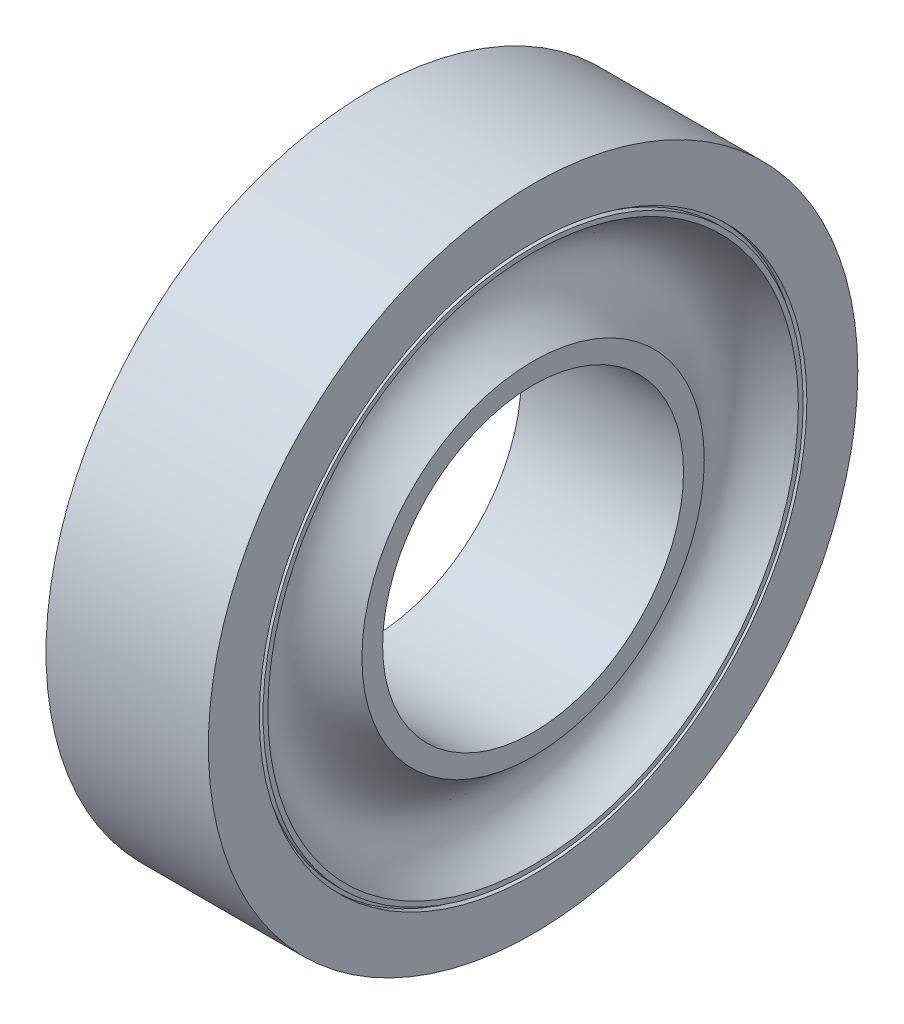
ISO-10303-21;
HEADER;
FILE_DESCRIPTION(('STEP AP214'),'2;1');
FILE_NAME('part.step','',(''),(''),'','','');
FILE_SCHEMA(('AUTOMOTIVE_DESIGN { 1 0 10303 214 1 1 1 1 }'));
ENDSEC;
DATA;
#1=APPLICATION_CONTEXT('core data for automotive mechanical design processes');
#2=APPLICATION_PROTOCOL_DEFINITION('international standard','automotive_design',2000,#1);
#3=PRODUCT_CONTEXT('',#1,'mechanical');
#4=PRODUCT('Part','Part','',(#3));
#5=PRODUCT_RELATED_PRODUCT_CATEGORY('part','',(#4));
#6=PRODUCT_DEFINITION_FORMATION('','',#4);
#7=PRODUCT_DEFINITION_CONTEXT('part definition',#1,'design');
#8=PRODUCT_DEFINITION('design','',#6,#7);
#9=PRODUCT_DEFINITION_SHAPE('','',#8);
#10=(LENGTH_UNIT() NAMED_UNIT(*) SI_UNIT(.MILLI.,.METRE.));
#11=(NAMED_UNIT(*) PLANE_ANGLE_UNIT() SI_UNIT($,.RADIAN.));
#12=(NAMED_UNIT(*) SI_UNIT($,.STERADIAN.) SOLID_ANGLE_UNIT());
#13=UNCERTAINTY_MEASURE_WITH_UNIT(LENGTH_MEASURE(1.E-05),#10,'distance_accuracy_value','');
#14=(GEOMETRIC_REPRESENTATION_CONTEXT(3) GLOBAL_UNCERTAINTY_ASSIGNED_CONTEXT((#13)) GLOBAL_UNIT_ASSIGNED_CONTEXT((#10,
#11,#12)) REPRESENTATION_CONTEXT('',''));
#15=CARTESIAN_POINT('',(0.,0.,0.));
#16=DIRECTION('',(0.,0.,1.));
#17=DIRECTION('',(1.,0.,0.));
#18=AXIS2_PLACEMENT_3D('',#15,#16,#17);
#19=CARTESIAN_POINT('',(-7.5,13.9,0.));
#20=DIRECTION('',(-1.,0.,0.));
#21=DIRECTION('',(0.,0.,1.));
#22=AXIS2_PLACEMENT_3D('',#19,#20,#21);
#23=PLANE('',#22);
#24=CARTESIAN_POINT('',(-7.49999999999999,0.,0.));
#25=DIRECTION('',(1.,0.,0.));
#26=DIRECTION('',(0.,0.,-1.));
#27=AXIS2_PLACEMENT_3D('',#24,#25,#26);
#28=CIRCLE('',#27,13.9);
#29=CARTESIAN_POINT('',(-7.49999999999999,0.,-13.9));
#30=VERTEX_POINT('',#29);
#31=EDGE_CURVE('E82',#30,#30,#28,.T.);
#32=ORIENTED_EDGE('',*,*,#31,.T.);
#33=EDGE_LOOP('',(#32));
#34=FACE_BOUND('',#33,.T.);
#35=CARTESIAN_POINT('',(-7.49999999999999,0.,0.));
#36=DIRECTION('',(1.,0.,0.));
#37=DIRECTION('',(0.,0.,-1.));
#38=AXIS2_PLACEMENT_3D('',#35,#36,#37);
#39=CIRCLE('',#38,15.8150324311788);
#40=CARTESIAN_POINT('',(-7.49999999999999,0.,-15.8150324311788));
#41=VERTEX_POINT('',#40);
#42=EDGE_CURVE('E10',#41,#41,#39,.T.);
#43=ORIENTED_EDGE('',*,*,#42,.F.);
#44=EDGE_LOOP('',(#43));
#45=FACE_BOUND('',#44,.T.);
#46=ADVANCED_FACE('F30',(#34,#45),#23,.T.);
#47=CARTESIAN_POINT('',(-7.5,24.5077089180318,0.));
#48=CARTESIAN_POINT('',(-0.221533758612963,20.8547837469212,0.));
#49=CARTESIAN_POINT('',(-7.5,15.8150324311788,0.));
#50=B_SPLINE_CURVE_WITH_KNOTS('',2,(#47,#48,#49),.UNSPECIFIED.,.F.,.F.,(3,3),(0.,1.),.UNSPECIFIED.);
#51=CARTESIAN_POINT('',(37.4227840582204,0.,0.));
#52=DIRECTION('',(1.,0.,0.));
#53=AXIS1_PLACEMENT('',#51,#52);
#54=SURFACE_OF_REVOLUTION('',#50,#53);
#55=ORIENTED_EDGE('',*,*,#42,.T.);
#56=EDGE_LOOP('',(#55));
#57=FACE_BOUND('',#56,.T.);
#58=CARTESIAN_POINT('',(-7.49999999999999,0.,0.));
#59=DIRECTION('',(1.,0.,0.));
#60=DIRECTION('',(0.,0.,-1.));
#61=AXIS2_PLACEMENT_3D('',#58,#59,#60);
#62=CIRCLE('',#61,24.5077089180318);
#63=CARTESIAN_POINT('',(-7.49999999999999,0.,-24.5077089180318));
#64=VERTEX_POINT('',#63);
#65=EDGE_CURVE('E36',#64,#64,#62,.T.);
#66=ORIENTED_EDGE('',*,*,#65,.F.);
#67=EDGE_LOOP('',(#66));
#68=FACE_BOUND('',#67,.T.);
#69=ADVANCED_FACE('F95',(#57,#68),#54,.F.);
#70=CARTESIAN_POINT('',(-7.5,24.5077089180318,0.));
#71=DIRECTION('',(-1.,0.,0.));
#72=DIRECTION('',(0.,0.,1.));
#73=AXIS2_PLACEMENT_3D('',#70,#71,#72);
#74=PLANE('',#73);
#75=ORIENTED_EDGE('',*,*,#65,.T.);
#76=EDGE_LOOP('',(#75));
#77=FACE_BOUND('',#76,.T.);
#78=CARTESIAN_POINT('',(-7.49999999999999,0.,0.));
#79=DIRECTION('',(1.,0.,0.));
#80=DIRECTION('',(0.,0.,-1.));
#81=AXIS2_PLACEMENT_3D('',#78,#79,#80);
#82=CIRCLE('',#81,24.9502716062252);
#83=CARTESIAN_POINT('',(-7.49999999999999,0.,-24.9502716062252));
#84=VERTEX_POINT('',#83);
#85=EDGE_CURVE('E40',#84,#84,#82,.T.);
#86=ORIENTED_EDGE('',*,*,#85,.F.);
#87=EDGE_LOOP('',(#86));
#88=FACE_BOUND('',#87,.T.);
#89=ADVANCED_FACE('F98',(#77,#88),#74,.T.);
#90=CARTESIAN_POINT('',(37.4227840582204,0.,0.));
#91=DIRECTION('',(1.,0.,0.));
#92=DIRECTION('',(0.,0.,-1.));
#93=AXIS2_PLACEMENT_3D('',#90,#91,#92);
#94=CYLINDRICAL_SURFACE('',#93,24.9502716062252);
#95=ORIENTED_EDGE('',*,*,#85,.T.);
#96=EDGE_LOOP('',(#95));
#97=FACE_BOUND('',#96,.T.);
#98=CARTESIAN_POINT('',(-6.95807618193402,0.,0.));
#99=DIRECTION('',(1.,0.,0.));
#100=DIRECTION('',(0.,0.,-1.));
#101=AXIS2_PLACEMENT_3D('',#98,#99,#100);
#102=CIRCLE('',#101,24.9502716062252);
#103=CARTESIAN_POINT('',(-6.95807618193402,0.,-24.9502716062252));
#104=VERTEX_POINT('',#103);
#105=EDGE_CURVE('E44',#104,#104,#102,.T.);
#106=ORIENTED_EDGE('',*,*,#105,.F.);
#107=EDGE_LOOP('',(#106));
#108=FACE_BOUND('',#107,.T.);
#109=ADVANCED_FACE('F101',(#97,#108),#94,.T.);
#110=CARTESIAN_POINT('',(-6.95807618193403,24.9502716062252,0.));
#111=DIRECTION('',(-1.,0.,0.));
#112=DIRECTION('',(0.,0.,1.));
#113=AXIS2_PLACEMENT_3D('',#110,#111,#112);
#114=PLANE('',#113);
#115=ORIENTED_EDGE('',*,*,#105,.T.);
#116=EDGE_LOOP('',(#115));
#117=FACE_BOUND('',#116,.T.);
#118=CARTESIAN_POINT('',(-6.95807618193402,0.,0.));
#119=DIRECTION('',(1.,0.,0.));
#120=DIRECTION('',(0.,0.,-1.));
#121=AXIS2_PLACEMENT_3D('',#118,#119,#120);
#122=CIRCLE('',#121,25.2929007841813);
#123=CARTESIAN_POINT('',(-6.95807618193402,0.,-25.2929007841813));
#124=VERTEX_POINT('',#123);
#125=EDGE_CURVE('E49',#124,#124,#122,.T.);
#126=ORIENTED_EDGE('',*,*,#125,.F.);
#127=EDGE_LOOP('',(#126));
#128=FACE_BOUND('',#127,.T.);
#129=ADVANCED_FACE('F104',(#117,#128),#114,.T.);
#130=CARTESIAN_POINT('',(37.4227840582204,0.,0.));
#131=DIRECTION('',(1.,0.,0.));
#132=DIRECTION('',(0.,0.,-1.));
#133=AXIS2_PLACEMENT_3D('',#130,#131,#132);
#134=CYLINDRICAL_SURFACE('',#133,25.2929007841813);
#135=ORIENTED_EDGE('',*,*,#125,.T.);
#136=EDGE_LOOP('',(#135));
#137=FACE_BOUND('',#136,.T.);
#138=CARTESIAN_POINT('',(-7.49999999999999,0.,0.));
#139=DIRECTION('',(1.,0.,0.));
#140=DIRECTION('',(0.,0.,-1.));
#141=AXIS2_PLACEMENT_3D('',#138,#139,#140);
#142=CIRCLE('',#141,25.2929007841813);
#143=CARTESIAN_POINT('',(-7.49999999999999,0.,-25.2929007841813));
#144=VERTEX_POINT('',#143);
#145=EDGE_CURVE('E52',#144,#144,#142,.T.);
#146=ORIENTED_EDGE('',*,*,#145,.F.);
#147=EDGE_LOOP('',(#146));
#148=FACE_BOUND('',#147,.T.);
#149=ADVANCED_FACE('F108',(#137,#148),#134,.F.);
#150=CARTESIAN_POINT('',(-7.5,25.2929007841813,0.));
#151=DIRECTION('',(-1.,0.,0.));
#152=DIRECTION('',(0.,0.,1.));
#153=AXIS2_PLACEMENT_3D('',#150,#151,#152);
#154=PLANE('',#153);
#155=ORIENTED_EDGE('',*,*,#145,.T.);
#156=EDGE_LOOP('',(#155));
#157=FACE_BOUND('',#156,.T.);
#158=CARTESIAN_POINT('',(-7.49999999999999,0.,0.));
#159=DIRECTION('',(1.,0.,0.));
#160=DIRECTION('',(0.,0.,-1.));
#161=AXIS2_PLACEMENT_3D('',#158,#159,#160);
#162=CIRCLE('',#161,30.);
#163=CARTESIAN_POINT('',(-7.49999999999999,0.,-30.));
#164=VERTEX_POINT('',#163);
#165=EDGE_CURVE('E55',#164,#164,#162,.T.);
#166=ORIENTED_EDGE('',*,*,#165,.F.);
#167=EDGE_LOOP('',(#166));
#168=FACE_BOUND('',#167,.T.);
#169=ADVANCED_FACE('F112',(#157,#168),#154,.T.);
#170=CARTESIAN_POINT('',(37.4227840582204,0.,0.));
#171=DIRECTION('',(1.,0.,0.));
#172=DIRECTION('',(0.,0.,-1.));
#173=AXIS2_PLACEMENT_3D('',#170,#171,#172);
#174=CYLINDRICAL_SURFACE('',#173,30.);
#175=ORIENTED_EDGE('',*,*,#165,.T.);
#176=EDGE_LOOP('',(#175));
#177=FACE_BOUND('',#176,.T.);
#178=CARTESIAN_POINT('',(7.5,0.,0.));
#179=DIRECTION('',(1.,0.,0.));
#180=DIRECTION('',(0.,0.,-1.));
#181=AXIS2_PLACEMENT_3D('',#178,#179,#180);
#182=CIRCLE('',#181,30.);
#183=CARTESIAN_POINT('',(7.5,0.,-30.));
#184=VERTEX_POINT('',#183);
#185=EDGE_CURVE('E58',#184,#184,#182,.T.);
#186=ORIENTED_EDGE('',*,*,#185,.F.);
#187=EDGE_LOOP('',(#186));
#188=FACE_BOUND('',#187,.T.);
#189=ADVANCED_FACE('F116',(#177,#188),#174,.T.);
#190=CARTESIAN_POINT('',(7.5,25.2929007841813,0.));
#191=DIRECTION('',(1.,0.,0.));
#192=DIRECTION('',(0.,0.,-1.));
#193=AXIS2_PLACEMENT_3D('',#190,#191,#192);
#194=PLANE('',#193);
#195=ORIENTED_EDGE('',*,*,#185,.T.);
#196=EDGE_LOOP('',(#195));
#197=FACE_BOUND('',#196,.T.);
#198=CARTESIAN_POINT('',(7.5,0.,0.));
#199=DIRECTION('',(1.,0.,0.));
#200=DIRECTION('',(0.,0.,-1.));
#201=AXIS2_PLACEMENT_3D('',#198,#199,#200);
#202=CIRCLE('',#201,25.2929007841813);
#203=CARTESIAN_POINT('',(7.5,0.,-25.2929007841813));
#204=VERTEX_POINT('',#203);
#205=EDGE_CURVE('E61',#204,#204,#202,.T.);
#206=ORIENTED_EDGE('',*,*,#205,.F.);
#207=EDGE_LOOP('',(#206));
#208=FACE_BOUND('',#207,.T.);
#209=ADVANCED_FACE('F120',(#197,#208),#194,.T.);
#210=CARTESIAN_POINT('',(37.4227840582204,0.,0.));
#211=DIRECTION('',(1.,0.,0.));
#212=DIRECTION('',(0.,0.,-1.));
#213=AXIS2_PLACEMENT_3D('',#210,#211,#212);
#214=CYLINDRICAL_SURFACE('',#213,25.2929007841813);
#215=ORIENTED_EDGE('',*,*,#205,.T.);
#216=EDGE_LOOP('',(#215));
#217=FACE_BOUND('',#216,.T.);
#218=CARTESIAN_POINT('',(6.95807618193403,0.,0.));
#219=DIRECTION('',(1.,0.,0.));
#220=DIRECTION('',(0.,0.,-1.));
#221=AXIS2_PLACEMENT_3D('',#218,#219,#220);
#222=CIRCLE('',#221,25.2929007841813);
#223=CARTESIAN_POINT('',(6.95807618193403,0.,-25.2929007841813));
#224=VERTEX_POINT('',#223);
#225=EDGE_CURVE('E64',#224,#224,#222,.T.);
#226=ORIENTED_EDGE('',*,*,#225,.F.);
#227=EDGE_LOOP('',(#226));
#228=FACE_BOUND('',#227,.T.);
#229=ADVANCED_FACE('F124',(#217,#228),#214,.F.);
#230=CARTESIAN_POINT('',(6.95807618193403,24.9502716062252,0.));
#231=DIRECTION('',(1.,0.,0.));
#232=DIRECTION('',(0.,0.,-1.));
#233=AXIS2_PLACEMENT_3D('',#230,#231,#232);
#234=PLANE('',#233);
#235=ORIENTED_EDGE('',*,*,#225,.T.);
#236=EDGE_LOOP('',(#235));
#237=FACE_BOUND('',#236,.T.);
#238=CARTESIAN_POINT('',(6.95807618193403,0.,0.));
#239=DIRECTION('',(1.,0.,0.));
#240=DIRECTION('',(0.,0.,-1.));
#241=AXIS2_PLACEMENT_3D('',#238,#239,#240);
#242=CIRCLE('',#241,24.9502716062252);
#243=CARTESIAN_POINT('',(6.95807618193403,0.,-24.9502716062252));
#244=VERTEX_POINT('',#243);
#245=EDGE_CURVE('E67',#244,#244,#242,.T.);
#246=ORIENTED_EDGE('',*,*,#245,.F.);
#247=EDGE_LOOP('',(#246));
#248=FACE_BOUND('',#247,.T.);
#249=ADVANCED_FACE('F128',(#237,#248),#234,.T.);
#250=CARTESIAN_POINT('',(37.4227840582204,0.,0.));
#251=DIRECTION('',(1.,0.,0.));
#252=DIRECTION('',(0.,0.,-1.));
#253=AXIS2_PLACEMENT_3D('',#250,#251,#252);
#254=CYLINDRICAL_SURFACE('',#253,24.9502716062252);
#255=ORIENTED_EDGE('',*,*,#245,.T.);
#256=EDGE_LOOP('',(#255));
#257=FACE_BOUND('',#256,.T.);
#258=CARTESIAN_POINT('',(7.5,0.,0.));
#259=DIRECTION('',(1.,0.,0.));
#260=DIRECTION('',(0.,0.,-1.));
#261=AXIS2_PLACEMENT_3D('',#258,#259,#260);
#262=CIRCLE('',#261,24.9502716062252);
#263=CARTESIAN_POINT('',(7.5,0.,-24.9502716062252));
#264=VERTEX_POINT('',#263);
#265=EDGE_CURVE('E70',#264,#264,#262,.T.);
#266=ORIENTED_EDGE('',*,*,#265,.F.);
#267=EDGE_LOOP('',(#266));
#268=FACE_BOUND('',#267,.T.);
#269=ADVANCED_FACE('F132',(#257,#268),#254,.T.);
#270=CARTESIAN_POINT('',(7.5,24.5077089180318,0.));
#271=DIRECTION('',(1.,0.,0.));
#272=DIRECTION('',(0.,0.,-1.));
#273=AXIS2_PLACEMENT_3D('',#270,#271,#272);
#274=PLANE('',#273);
#275=ORIENTED_EDGE('',*,*,#265,.T.);
#276=EDGE_LOOP('',(#275));
#277=FACE_BOUND('',#276,.T.);
#278=CARTESIAN_POINT('',(7.5,0.,0.));
#279=DIRECTION('',(1.,0.,0.));
#280=DIRECTION('',(0.,0.,-1.));
#281=AXIS2_PLACEMENT_3D('',#278,#279,#280);
#282=CIRCLE('',#281,24.5077089180318);
#283=CARTESIAN_POINT('',(7.5,0.,-24.5077089180318));
#284=VERTEX_POINT('',#283);
#285=EDGE_CURVE('E73',#284,#284,#282,.T.);
#286=ORIENTED_EDGE('',*,*,#285,.F.);
#287=EDGE_LOOP('',(#286));
#288=FACE_BOUND('',#287,.T.);
#289=ADVANCED_FACE('F136',(#277,#288),#274,.T.);
#290=CARTESIAN_POINT('',(7.50000000000001,15.8150324311788,0.));
#291=CARTESIAN_POINT('',(0.221533758612972,20.8547837469212,0.));
#292=CARTESIAN_POINT('',(7.5,24.5077089180318,0.));
#293=B_SPLINE_CURVE_WITH_KNOTS('',2,(#290,#291,#292),.UNSPECIFIED.,.F.,.F.,(3,3),(0.,1.),.UNSPECIFIED.);
#294=CARTESIAN_POINT('',(37.4227840582204,0.,0.));
#295=DIRECTION('',(1.,0.,0.));
#296=AXIS1_PLACEMENT('',#294,#295);
#297=SURFACE_OF_REVOLUTION('',#293,#296);
#298=ORIENTED_EDGE('',*,*,#285,.T.);
#299=EDGE_LOOP('',(#298));
#300=FACE_BOUND('',#299,.T.);
#301=CARTESIAN_POINT('',(7.50000000000001,0.,0.));
#302=DIRECTION('',(1.,0.,0.));
#303=DIRECTION('',(0.,0.,-1.));
#304=AXIS2_PLACEMENT_3D('',#301,#302,#303);
#305=CIRCLE('',#304,15.8150324311788);
#306=CARTESIAN_POINT('',(7.50000000000001,0.,-15.8150324311788));
#307=VERTEX_POINT('',#306);
#308=EDGE_CURVE('E76',#307,#307,#305,.T.);
#309=ORIENTED_EDGE('',*,*,#308,.F.);
#310=EDGE_LOOP('',(#309));
#311=FACE_BOUND('',#310,.T.);
#312=ADVANCED_FACE('F140',(#300,#311),#297,.F.);
#313=CARTESIAN_POINT('',(7.50000000000001,13.9,0.));
#314=DIRECTION('',(1.,0.,0.));
#315=DIRECTION('',(0.,0.,-1.));
#316=AXIS2_PLACEMENT_3D('',#313,#314,#315);
#317=PLANE('',#316);
#318=ORIENTED_EDGE('',*,*,#308,.T.);
#319=EDGE_LOOP('',(#318));
#320=FACE_BOUND('',#319,.T.);
#321=CARTESIAN_POINT('',(7.50000000000001,0.,0.));
#322=DIRECTION('',(1.,0.,0.));
#323=DIRECTION('',(0.,0.,-1.));
#324=AXIS2_PLACEMENT_3D('',#321,#322,#323);
#325=CIRCLE('',#324,13.9);
#326=CARTESIAN_POINT('',(7.50000000000001,0.,-13.9));
#327=VERTEX_POINT('',#326);
#328=EDGE_CURVE('E79',#327,#327,#325,.T.);
#329=ORIENTED_EDGE('',*,*,#328,.F.);
#330=EDGE_LOOP('',(#329));
#331=FACE_BOUND('',#330,.T.);
#332=ADVANCED_FACE('F144',(#320,#331),#317,.T.);
#333=CARTESIAN_POINT('',(37.4227840582204,0.,0.));
#334=DIRECTION('',(1.,0.,0.));
#335=DIRECTION('',(0.,0.,-1.));
#336=AXIS2_PLACEMENT_3D('',#333,#334,#335);
#337=CYLINDRICAL_SURFACE('',#336,13.9);
#338=ORIENTED_EDGE('',*,*,#328,.T.);
#339=EDGE_LOOP('',(#338));
#340=FACE_BOUND('',#339,.T.);
#341=ORIENTED_EDGE('',*,*,#31,.F.);
#342=EDGE_LOOP('',(#341));
#343=FACE_BOUND('',#342,.T.);
#344=ADVANCED_FACE('F148',(#340,#343),#337,.F.);
#345=CLOSED_SHELL('',(#46,#69,#89,#109,#129,#149,#169,#189,#209,#229,#249,#269,#289,#312,#332,#344));
#346=MANIFOLD_SOLID_BREP('B2',#345);
#347=ADVANCED_BREP_SHAPE_REPRESENTATION('',(#18,#346),#14);
#348=SHAPE_DEFINITION_REPRESENTATION(#9,#347);
ENDSEC;
END-ISO-10303-21;
